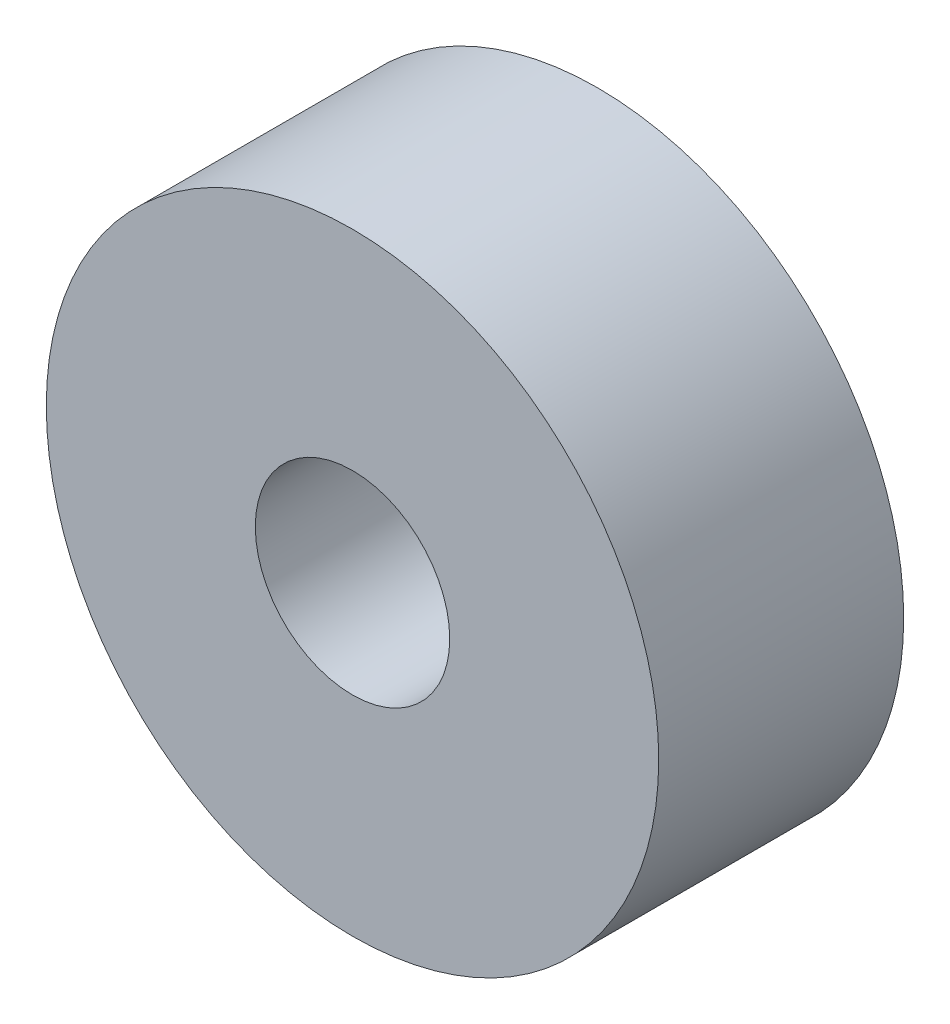
ISO-10303-21;
HEADER;
FILE_DESCRIPTION(('STEP AP214'),'2;1');
FILE_NAME('part.step','',(''),(''),'','','');
FILE_SCHEMA(('AUTOMOTIVE_DESIGN { 1 0 10303 214 1 1 1 1 }'));
ENDSEC;
DATA;
#1=APPLICATION_CONTEXT('core data for automotive mechanical design processes');
#2=APPLICATION_PROTOCOL_DEFINITION('international standard','automotive_design',2000,#1);
#3=PRODUCT_CONTEXT('',#1,'mechanical');
#4=PRODUCT('Part','Part','',(#3));
#5=PRODUCT_RELATED_PRODUCT_CATEGORY('part','',(#4));
#6=PRODUCT_DEFINITION_FORMATION('','',#4);
#7=PRODUCT_DEFINITION_CONTEXT('part definition',#1,'design');
#8=PRODUCT_DEFINITION('design','',#6,#7);
#9=PRODUCT_DEFINITION_SHAPE('','',#8);
#10=(LENGTH_UNIT() NAMED_UNIT(*) SI_UNIT(.MILLI.,.METRE.));
#11=(NAMED_UNIT(*) PLANE_ANGLE_UNIT() SI_UNIT($,.RADIAN.));
#12=(NAMED_UNIT(*) SI_UNIT($,.STERADIAN.) SOLID_ANGLE_UNIT());
#13=UNCERTAINTY_MEASURE_WITH_UNIT(LENGTH_MEASURE(1.E-05),#10,'distance_accuracy_value','');
#14=(GEOMETRIC_REPRESENTATION_CONTEXT(3) GLOBAL_UNCERTAINTY_ASSIGNED_CONTEXT((#13)) GLOBAL_UNIT_ASSIGNED_CONTEXT((#10,
#11,#12)) REPRESENTATION_CONTEXT('',''));
#15=CARTESIAN_POINT('',(0.,0.,0.));
#16=DIRECTION('',(0.,0.,1.));
#17=DIRECTION('',(1.,0.,0.));
#18=AXIS2_PLACEMENT_3D('',#15,#16,#17);
#19=CARTESIAN_POINT('',(0.,0.,4.));
#20=DIRECTION('',(0.,0.,1.));
#21=DIRECTION('',(1.,0.,0.));
#22=AXIS2_PLACEMENT_3D('',#19,#20,#21);
#23=PLANE('',#22);
#24=CARTESIAN_POINT('',(0.,0.,4.));
#25=DIRECTION('',(0.,0.,1.));
#26=DIRECTION('',(1.,0.,0.));
#27=AXIS2_PLACEMENT_3D('',#24,#25,#26);
#28=CIRCLE('',#27,5.);
#29=CARTESIAN_POINT('',(5.,0.,4.));
#30=VERTEX_POINT('',#29);
#31=EDGE_CURVE('E10',#30,#30,#28,.T.);
#32=ORIENTED_EDGE('',*,*,#31,.T.);
#33=EDGE_LOOP('',(#32));
#34=FACE_BOUND('',#33,.T.);
#35=CARTESIAN_POINT('',(0.,0.,4.));
#36=DIRECTION('',(0.,0.,1.));
#37=DIRECTION('',(1.,0.,0.));
#38=AXIS2_PLACEMENT_3D('',#35,#36,#37);
#39=CIRCLE('',#38,1.5875);
#40=CARTESIAN_POINT('',(1.5875,0.,4.));
#41=VERTEX_POINT('',#40);
#42=EDGE_CURVE('E42',#41,#41,#39,.T.);
#43=ORIENTED_EDGE('',*,*,#42,.F.);
#44=EDGE_LOOP('',(#43));
#45=FACE_BOUND('',#44,.T.);
#46=ADVANCED_FACE('F31',(#34,#45),#23,.T.);
#47=CARTESIAN_POINT('',(0.,0.,0.));
#48=DIRECTION('',(0.,0.,1.));
#49=DIRECTION('',(1.,0.,0.));
#50=AXIS2_PLACEMENT_3D('',#47,#48,#49);
#51=PLANE('',#50);
#52=CARTESIAN_POINT('',(0.,0.,0.));
#53=DIRECTION('',(0.,0.,1.));
#54=DIRECTION('',(1.,0.,0.));
#55=AXIS2_PLACEMENT_3D('',#52,#53,#54);
#56=CIRCLE('',#55,5.);
#57=CARTESIAN_POINT('',(5.,0.,0.));
#58=VERTEX_POINT('',#57);
#59=EDGE_CURVE('E35',#58,#58,#56,.T.);
#60=ORIENTED_EDGE('',*,*,#59,.F.);
#61=EDGE_LOOP('',(#60));
#62=FACE_BOUND('',#61,.T.);
#63=CARTESIAN_POINT('',(0.,0.,0.));
#64=DIRECTION('',(0.,0.,1.));
#65=DIRECTION('',(1.,0.,0.));
#66=AXIS2_PLACEMENT_3D('',#63,#64,#65);
#67=CIRCLE('',#66,1.5875);
#68=CARTESIAN_POINT('',(1.5875,0.,0.));
#69=VERTEX_POINT('',#68);
#70=EDGE_CURVE('E44',#69,#69,#67,.T.);
#71=ORIENTED_EDGE('',*,*,#70,.T.);
#72=EDGE_LOOP('',(#71));
#73=FACE_BOUND('',#72,.T.);
#74=ADVANCED_FACE('F54',(#62,#73),#51,.F.);
#75=CARTESIAN_POINT('',(0.,0.,4.));
#76=DIRECTION('',(0.,0.,-1.));
#77=DIRECTION('',(-1.,0.,0.));
#78=AXIS2_PLACEMENT_3D('',#75,#76,#77);
#79=CYLINDRICAL_SURFACE('',#78,5.);
#80=ORIENTED_EDGE('',*,*,#31,.F.);
#81=EDGE_LOOP('',(#80));
#82=FACE_BOUND('',#81,.T.);
#83=ORIENTED_EDGE('',*,*,#59,.T.);
#84=EDGE_LOOP('',(#83));
#85=FACE_BOUND('',#84,.T.);
#86=ADVANCED_FACE('F33',(#82,#85),#79,.T.);
#87=CARTESIAN_POINT('',(0.,0.,4.));
#88=DIRECTION('',(0.,0.,-1.));
#89=DIRECTION('',(-1.,0.,0.));
#90=AXIS2_PLACEMENT_3D('',#87,#88,#89);
#91=CYLINDRICAL_SURFACE('',#90,1.5875);
#92=ORIENTED_EDGE('',*,*,#42,.T.);
#93=EDGE_LOOP('',(#92));
#94=FACE_BOUND('',#93,.T.);
#95=ORIENTED_EDGE('',*,*,#70,.F.);
#96=EDGE_LOOP('',(#95));
#97=FACE_BOUND('',#96,.T.);
#98=ADVANCED_FACE('F50',(#94,#97),#91,.F.);
#99=CLOSED_SHELL('',(#46,#74,#86,#98));
#100=MANIFOLD_SOLID_BREP('B2',#99);
#101=ADVANCED_BREP_SHAPE_REPRESENTATION('',(#18,#100),#14);
#102=SHAPE_DEFINITION_REPRESENTATION(#9,#101);
ENDSEC;
END-ISO-10303-21;
